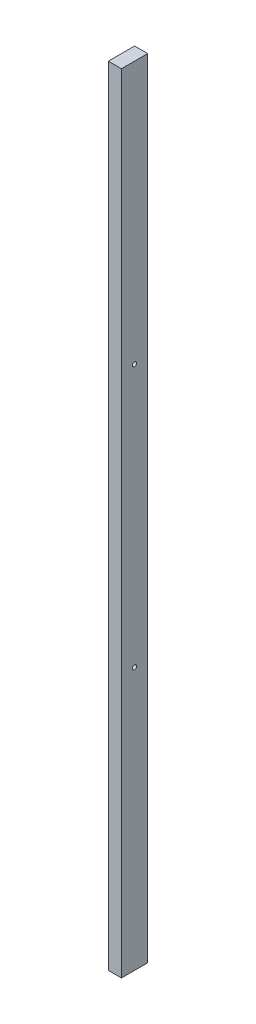
ISO-10303-21;
HEADER;
FILE_DESCRIPTION(('STEP AP214'),'2;1');
FILE_NAME('part.step','',(''),(''),'','','');
FILE_SCHEMA(('AUTOMOTIVE_DESIGN { 1 0 10303 214 1 1 1 1 }'));
ENDSEC;
DATA;
#1=APPLICATION_CONTEXT('core data for automotive mechanical design processes');
#2=APPLICATION_PROTOCOL_DEFINITION('international standard','automotive_design',2000,#1);
#3=PRODUCT_CONTEXT('',#1,'mechanical');
#4=PRODUCT('Part','Part','',(#3));
#5=PRODUCT_RELATED_PRODUCT_CATEGORY('part','',(#4));
#6=PRODUCT_DEFINITION_FORMATION('','',#4);
#7=PRODUCT_DEFINITION_CONTEXT('part definition',#1,'design');
#8=PRODUCT_DEFINITION('design','',#6,#7);
#9=PRODUCT_DEFINITION_SHAPE('','',#8);
#10=(LENGTH_UNIT() NAMED_UNIT(*) SI_UNIT(.MILLI.,.METRE.));
#11=(NAMED_UNIT(*) PLANE_ANGLE_UNIT() SI_UNIT($,.RADIAN.));
#12=(NAMED_UNIT(*) SI_UNIT($,.STERADIAN.) SOLID_ANGLE_UNIT());
#13=UNCERTAINTY_MEASURE_WITH_UNIT(LENGTH_MEASURE(1.E-05),#10,'distance_accuracy_value','');
#14=(GEOMETRIC_REPRESENTATION_CONTEXT(3) GLOBAL_UNCERTAINTY_ASSIGNED_CONTEXT((#13)) GLOBAL_UNIT_ASSIGNED_CONTEXT((#10,
#11,#12)) REPRESENTATION_CONTEXT('',''));
#15=CARTESIAN_POINT('',(0.,0.,0.));
#16=DIRECTION('',(0.,0.,1.));
#17=DIRECTION('',(1.,0.,0.));
#18=AXIS2_PLACEMENT_3D('',#15,#16,#17);
#19=CARTESIAN_POINT('',(-12.5,1500.,-25.));
#20=DIRECTION('',(1.,0.,0.));
#21=DIRECTION('',(0.,0.,-1.));
#22=AXIS2_PLACEMENT_3D('',#19,#20,#21);
#23=PLANE('',#22);
#24=CARTESIAN_POINT('',(-12.5,1000.,0.));
#25=DIRECTION('',(-1.,0.,0.));
#26=DIRECTION('',(0.,0.,1.));
#27=AXIS2_PLACEMENT_3D('',#24,#25,#26);
#28=CIRCLE('',#27,4.);
#29=CARTESIAN_POINT('',(-12.5,1000.,4.));
#30=VERTEX_POINT('',#29);
#31=EDGE_CURVE('E130',#30,#30,#28,.T.);
#32=ORIENTED_EDGE('',*,*,#31,.F.);
#33=EDGE_LOOP('',(#32));
#34=FACE_BOUND('',#33,.T.);
#35=CARTESIAN_POINT('',(-12.5,500.,0.));
#36=DIRECTION('',(-1.,0.,0.));
#37=DIRECTION('',(0.,0.,1.));
#38=AXIS2_PLACEMENT_3D('',#35,#36,#37);
#39=CIRCLE('',#38,4.);
#40=CARTESIAN_POINT('',(-12.5,500.,4.));
#41=VERTEX_POINT('',#40);
#42=EDGE_CURVE('E137',#41,#41,#39,.T.);
#43=ORIENTED_EDGE('',*,*,#42,.F.);
#44=EDGE_LOOP('',(#43));
#45=FACE_BOUND('',#44,.T.);
#46=DIRECTION('',(0.,0.,1.));
#47=VECTOR('',#46,1.);
#48=CARTESIAN_POINT('',(-12.5,0.,-25.));
#49=LINE('',#48,#47);
#50=CARTESIAN_POINT('',(-12.5,0.,-25.));
#51=VERTEX_POINT('',#50);
#52=CARTESIAN_POINT('',(-12.5,0.,25.));
#53=VERTEX_POINT('',#52);
#54=EDGE_CURVE('E114',#51,#53,#49,.T.);
#55=ORIENTED_EDGE('',*,*,#54,.T.);
#56=DIRECTION('',(0.,-1.,0.));
#57=VECTOR('',#56,1.);
#58=CARTESIAN_POINT('',(-12.5,1500.,25.));
#59=LINE('',#58,#57);
#60=CARTESIAN_POINT('',(-12.5,1500.,25.));
#61=VERTEX_POINT('',#60);
#62=EDGE_CURVE('E11',#61,#53,#59,.T.);
#63=ORIENTED_EDGE('',*,*,#62,.F.);
#64=DIRECTION('',(0.,0.,1.));
#65=VECTOR('',#64,1.);
#66=CARTESIAN_POINT('',(-12.5,1500.,-25.));
#67=LINE('',#66,#65);
#68=CARTESIAN_POINT('',(-12.5,1500.,-25.));
#69=VERTEX_POINT('',#68);
#70=EDGE_CURVE('E97',#69,#61,#67,.T.);
#71=ORIENTED_EDGE('',*,*,#70,.F.);
#72=DIRECTION('',(0.,-1.,0.));
#73=VECTOR('',#72,1.);
#74=CARTESIAN_POINT('',(-12.5,1500.,-25.));
#75=LINE('',#74,#73);
#76=EDGE_CURVE('E110',#69,#51,#75,.T.);
#77=ORIENTED_EDGE('',*,*,#76,.T.);
#78=EDGE_LOOP('',(#55,#63,#71,#77));
#79=FACE_BOUND('',#78,.T.);
#80=ADVANCED_FACE('F43',(#34,#45,#79),#23,.F.);
#81=CARTESIAN_POINT('',(12.5,1500.,25.));
#82=DIRECTION('',(0.,0.,-1.));
#83=DIRECTION('',(-1.,0.,0.));
#84=AXIS2_PLACEMENT_3D('',#81,#82,#83);
#85=PLANE('',#84);
#86=DIRECTION('',(1.,0.,0.));
#87=VECTOR('',#86,1.);
#88=CARTESIAN_POINT('',(12.5,0.,25.));
#89=LINE('',#88,#87);
#90=CARTESIAN_POINT('',(12.5,0.,25.));
#91=VERTEX_POINT('',#90);
#92=EDGE_CURVE('E102',#53,#91,#89,.T.);
#93=ORIENTED_EDGE('',*,*,#92,.T.);
#94=DIRECTION('',(0.,-1.,0.));
#95=VECTOR('',#94,1.);
#96=CARTESIAN_POINT('',(12.5,1500.,25.));
#97=LINE('',#96,#95);
#98=CARTESIAN_POINT('',(12.5,1500.,25.));
#99=VERTEX_POINT('',#98);
#100=EDGE_CURVE('E53',#99,#91,#97,.T.);
#101=ORIENTED_EDGE('',*,*,#100,.F.);
#102=DIRECTION('',(1.,0.,0.));
#103=VECTOR('',#102,1.);
#104=CARTESIAN_POINT('',(12.5,1500.,25.));
#105=LINE('',#104,#103);
#106=EDGE_CURVE('E92',#61,#99,#105,.T.);
#107=ORIENTED_EDGE('',*,*,#106,.F.);
#108=ORIENTED_EDGE('',*,*,#62,.T.);
#109=EDGE_LOOP('',(#93,#101,#107,#108));
#110=FACE_BOUND('',#109,.T.);
#111=ADVANCED_FACE('F101',(#110),#85,.F.);
#112=CARTESIAN_POINT('',(12.5,1500.,-25.));
#113=DIRECTION('',(-1.,0.,0.));
#114=DIRECTION('',(0.,0.,1.));
#115=AXIS2_PLACEMENT_3D('',#112,#113,#114);
#116=PLANE('',#115);
#117=CARTESIAN_POINT('',(12.5,1000.,0.));
#118=DIRECTION('',(-1.,0.,0.));
#119=DIRECTION('',(0.,0.,1.));
#120=AXIS2_PLACEMENT_3D('',#117,#118,#119);
#121=CIRCLE('',#120,4.);
#122=CARTESIAN_POINT('',(12.5,1000.,4.));
#123=VERTEX_POINT('',#122);
#124=EDGE_CURVE('E46',#123,#123,#121,.T.);
#125=ORIENTED_EDGE('',*,*,#124,.T.);
#126=EDGE_LOOP('',(#125));
#127=FACE_BOUND('',#126,.T.);
#128=CARTESIAN_POINT('',(12.5,500.,0.));
#129=DIRECTION('',(-1.,0.,0.));
#130=DIRECTION('',(0.,0.,1.));
#131=AXIS2_PLACEMENT_3D('',#128,#129,#130);
#132=CIRCLE('',#131,4.);
#133=CARTESIAN_POINT('',(12.5,500.,4.));
#134=VERTEX_POINT('',#133);
#135=EDGE_CURVE('E127',#134,#134,#132,.T.);
#136=ORIENTED_EDGE('',*,*,#135,.T.);
#137=EDGE_LOOP('',(#136));
#138=FACE_BOUND('',#137,.T.);
#139=DIRECTION('',(0.,0.,-1.));
#140=VECTOR('',#139,1.);
#141=CARTESIAN_POINT('',(12.5,0.,-25.));
#142=LINE('',#141,#140);
#143=CARTESIAN_POINT('',(12.5,0.,-25.));
#144=VERTEX_POINT('',#143);
#145=EDGE_CURVE('E79',#91,#144,#142,.T.);
#146=ORIENTED_EDGE('',*,*,#145,.T.);
#147=DIRECTION('',(0.,-1.,0.));
#148=VECTOR('',#147,1.);
#149=CARTESIAN_POINT('',(12.5,1500.,-25.));
#150=LINE('',#149,#148);
#151=CARTESIAN_POINT('',(12.5,1500.,-25.));
#152=VERTEX_POINT('',#151);
#153=EDGE_CURVE('E104',#152,#144,#150,.T.);
#154=ORIENTED_EDGE('',*,*,#153,.F.);
#155=DIRECTION('',(0.,0.,-1.));
#156=VECTOR('',#155,1.);
#157=CARTESIAN_POINT('',(12.5,1500.,-25.));
#158=LINE('',#157,#156);
#159=EDGE_CURVE('E95',#99,#152,#158,.T.);
#160=ORIENTED_EDGE('',*,*,#159,.F.);
#161=ORIENTED_EDGE('',*,*,#100,.T.);
#162=EDGE_LOOP('',(#146,#154,#160,#161));
#163=FACE_BOUND('',#162,.T.);
#164=ADVANCED_FACE('F106',(#127,#138,#163),#116,.F.);
#165=CARTESIAN_POINT('',(12.5,1500.,-25.));
#166=DIRECTION('',(0.,0.,1.));
#167=DIRECTION('',(1.,0.,0.));
#168=AXIS2_PLACEMENT_3D('',#165,#166,#167);
#169=PLANE('',#168);
#170=DIRECTION('',(-1.,0.,0.));
#171=VECTOR('',#170,1.);
#172=CARTESIAN_POINT('',(12.5,0.,-25.));
#173=LINE('',#172,#171);
#174=EDGE_CURVE('E85',#144,#51,#173,.T.);
#175=ORIENTED_EDGE('',*,*,#174,.T.);
#176=ORIENTED_EDGE('',*,*,#76,.F.);
#177=DIRECTION('',(-1.,0.,0.));
#178=VECTOR('',#177,1.);
#179=CARTESIAN_POINT('',(12.5,1500.,-25.));
#180=LINE('',#179,#178);
#181=EDGE_CURVE('E62',#152,#69,#180,.T.);
#182=ORIENTED_EDGE('',*,*,#181,.F.);
#183=ORIENTED_EDGE('',*,*,#153,.T.);
#184=EDGE_LOOP('',(#175,#176,#182,#183));
#185=FACE_BOUND('',#184,.T.);
#186=ADVANCED_FACE('F164',(#185),#169,.F.);
#187=CARTESIAN_POINT('',(0.,1500.,0.));
#188=DIRECTION('',(0.,-1.,0.));
#189=DIRECTION('',(0.,0.,-1.));
#190=AXIS2_PLACEMENT_3D('',#187,#188,#189);
#191=PLANE('',#190);
#192=ORIENTED_EDGE('',*,*,#70,.T.);
#193=ORIENTED_EDGE('',*,*,#106,.T.);
#194=ORIENTED_EDGE('',*,*,#159,.T.);
#195=ORIENTED_EDGE('',*,*,#181,.T.);
#196=EDGE_LOOP('',(#192,#193,#194,#195));
#197=FACE_BOUND('',#196,.T.);
#198=ADVANCED_FACE('F93',(#197),#191,.F.);
#199=CARTESIAN_POINT('',(0.,0.,0.));
#200=DIRECTION('',(0.,-1.,0.));
#201=DIRECTION('',(0.,0.,-1.));
#202=AXIS2_PLACEMENT_3D('',#199,#200,#201);
#203=PLANE('',#202);
#204=ORIENTED_EDGE('',*,*,#54,.F.);
#205=ORIENTED_EDGE('',*,*,#174,.F.);
#206=ORIENTED_EDGE('',*,*,#145,.F.);
#207=ORIENTED_EDGE('',*,*,#92,.F.);
#208=EDGE_LOOP('',(#204,#205,#206,#207));
#209=FACE_BOUND('',#208,.T.);
#210=ADVANCED_FACE('F155',(#209),#203,.T.);
#211=CARTESIAN_POINT('',(1487.5,500.,0.));
#212=DIRECTION('',(-1.,0.,0.));
#213=DIRECTION('',(0.,0.,1.));
#214=AXIS2_PLACEMENT_3D('',#211,#212,#213);
#215=CYLINDRICAL_SURFACE('',#214,4.);
#216=ORIENTED_EDGE('',*,*,#42,.T.);
#217=EDGE_LOOP('',(#216));
#218=FACE_BOUND('',#217,.T.);
#219=ORIENTED_EDGE('',*,*,#135,.F.);
#220=EDGE_LOOP('',(#219));
#221=FACE_BOUND('',#220,.T.);
#222=ADVANCED_FACE('F147',(#218,#221),#215,.F.);
#223=CARTESIAN_POINT('',(1487.5,1000.,0.));
#224=DIRECTION('',(-1.,0.,0.));
#225=DIRECTION('',(0.,0.,1.));
#226=AXIS2_PLACEMENT_3D('',#223,#224,#225);
#227=CYLINDRICAL_SURFACE('',#226,4.);
#228=ORIENTED_EDGE('',*,*,#31,.T.);
#229=EDGE_LOOP('',(#228));
#230=FACE_BOUND('',#229,.T.);
#231=ORIENTED_EDGE('',*,*,#124,.F.);
#232=EDGE_LOOP('',(#231));
#233=FACE_BOUND('',#232,.T.);
#234=ADVANCED_FACE('F162',(#230,#233),#227,.F.);
#235=CLOSED_SHELL('',(#80,#111,#164,#186,#198,#210,#222,#234));
#236=MANIFOLD_SOLID_BREP('B2',#235);
#237=ADVANCED_BREP_SHAPE_REPRESENTATION('',(#18,#236),#14);
#238=SHAPE_DEFINITION_REPRESENTATION(#9,#237);
ENDSEC;
END-ISO-10303-21;
